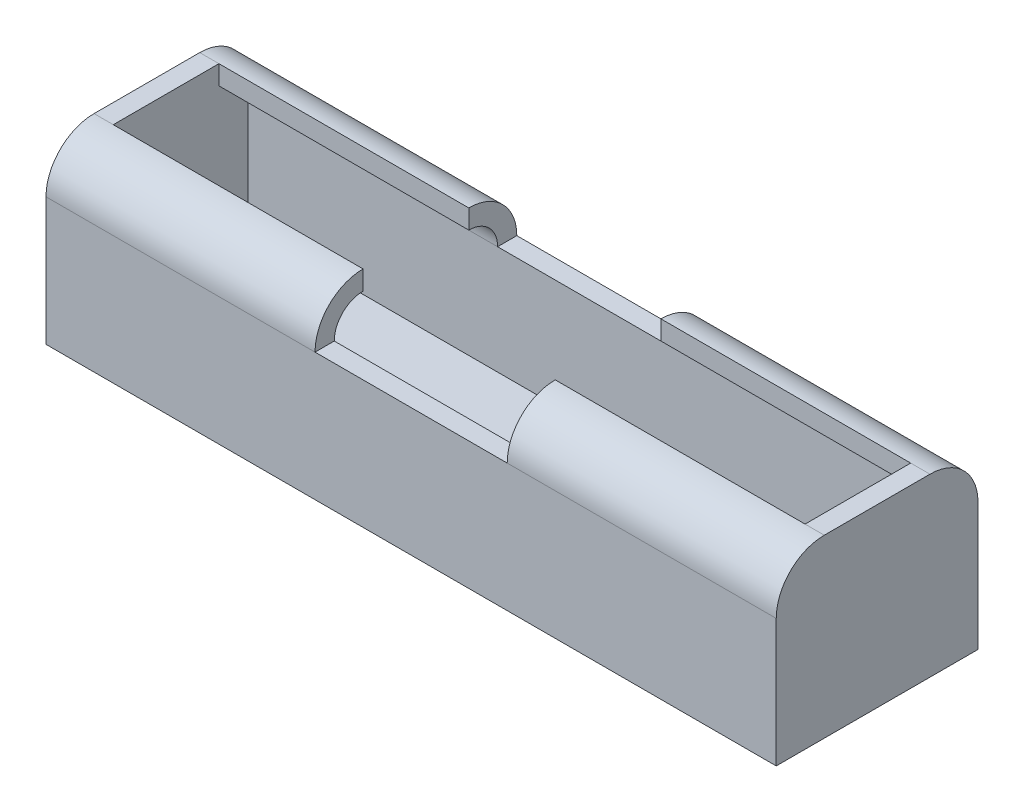
ISO-10303-21;
HEADER;
FILE_DESCRIPTION(('STEP AP214'),'2;1');
FILE_NAME('part.step','',(''),(''),'','','');
FILE_SCHEMA(('AUTOMOTIVE_DESIGN { 1 0 10303 214 1 1 1 1 }'));
ENDSEC;
DATA;
#1=APPLICATION_CONTEXT('core data for automotive mechanical design processes');
#2=APPLICATION_PROTOCOL_DEFINITION('international standard','automotive_design',2000,#1);
#3=PRODUCT_CONTEXT('',#1,'mechanical');
#4=PRODUCT('Part','Part','',(#3));
#5=PRODUCT_RELATED_PRODUCT_CATEGORY('part','',(#4));
#6=PRODUCT_DEFINITION_FORMATION('','',#4);
#7=PRODUCT_DEFINITION_CONTEXT('part definition',#1,'design');
#8=PRODUCT_DEFINITION('design','',#6,#7);
#9=PRODUCT_DEFINITION_SHAPE('','',#8);
#10=(LENGTH_UNIT() NAMED_UNIT(*) SI_UNIT(.MILLI.,.METRE.));
#11=(NAMED_UNIT(*) PLANE_ANGLE_UNIT() SI_UNIT($,.RADIAN.));
#12=(NAMED_UNIT(*) SI_UNIT($,.STERADIAN.) SOLID_ANGLE_UNIT());
#13=UNCERTAINTY_MEASURE_WITH_UNIT(LENGTH_MEASURE(1.E-05),#10,'distance_accuracy_value','');
#14=(GEOMETRIC_REPRESENTATION_CONTEXT(3) GLOBAL_UNCERTAINTY_ASSIGNED_CONTEXT((#13)) GLOBAL_UNIT_ASSIGNED_CONTEXT((#10,
#11,#12)) REPRESENTATION_CONTEXT('',''));
#15=CARTESIAN_POINT('',(0.,0.,0.));
#16=DIRECTION('',(0.,0.,1.));
#17=DIRECTION('',(1.,0.,0.));
#18=AXIS2_PLACEMENT_3D('',#15,#16,#17);
#19=CARTESIAN_POINT('',(38.,4.15,-5.5));
#20=DIRECTION('',(-1.,0.,0.));
#21=DIRECTION('',(0.,0.,1.));
#22=AXIS2_PLACEMENT_3D('',#19,#20,#21);
#23=CYLINDRICAL_SURFACE('',#22,5.);
#24=DIRECTION('',(-1.,0.,0.));
#25=VECTOR('',#24,1.);
#26=CARTESIAN_POINT('',(38.,4.14999999999996,-10.5));
#27=LINE('',#26,#25);
#28=CARTESIAN_POINT('',(38.,4.14999999999996,-10.5));
#29=VERTEX_POINT('',#28);
#30=CARTESIAN_POINT('',(10.,4.15,-10.5));
#31=VERTEX_POINT('',#30);
#32=EDGE_CURVE('E363',#29,#31,#27,.T.);
#33=ORIENTED_EDGE('',*,*,#32,.T.);
#34=CARTESIAN_POINT('',(10.,4.15,-5.5));
#35=DIRECTION('',(1.,0.,0.));
#36=DIRECTION('',(0.,0.,-1.));
#37=AXIS2_PLACEMENT_3D('',#34,#35,#36);
#38=CIRCLE('',#37,5.);
#39=CARTESIAN_POINT('',(10.,9.15,-5.49999999999997));
#40=VERTEX_POINT('',#39);
#41=EDGE_CURVE('E247',#31,#40,#38,.T.);
#42=ORIENTED_EDGE('',*,*,#41,.T.);
#43=DIRECTION('',(-1.,0.,0.));
#44=VECTOR('',#43,1.);
#45=CARTESIAN_POINT('',(38.,9.15,-5.49999999999997));
#46=LINE('',#45,#44);
#47=CARTESIAN_POINT('',(36.,9.15,-5.49999999999997));
#48=VERTEX_POINT('',#47);
#49=EDGE_CURVE('E256',#48,#40,#46,.T.);
#50=ORIENTED_EDGE('',*,*,#49,.F.);
#51=DIRECTION('',(-1.,0.,0.));
#52=VECTOR('',#51,1.);
#53=CARTESIAN_POINT('',(38.,9.15,-5.49999999999997));
#54=LINE('',#53,#52);
#55=CARTESIAN_POINT('',(38.,9.15,-5.49999999999997));
#56=VERTEX_POINT('',#55);
#57=EDGE_CURVE('E359',#56,#48,#54,.T.);
#58=ORIENTED_EDGE('',*,*,#57,.F.);
#59=CARTESIAN_POINT('',(38.,4.15,-5.5));
#60=DIRECTION('',(1.,0.,0.));
#61=DIRECTION('',(0.,0.,-1.));
#62=AXIS2_PLACEMENT_3D('',#59,#60,#61);
#63=CIRCLE('',#62,5.);
#64=EDGE_CURVE('E326',#29,#56,#63,.T.);
#65=ORIENTED_EDGE('',*,*,#64,.F.);
#66=EDGE_LOOP('',(#33,#42,#50,#58,#65));
#67=FACE_BOUND('',#66,.T.);
#68=ADVANCED_FACE('F33',(#67),#23,.T.);
#69=CARTESIAN_POINT('',(38.,4.15,5.5));
#70=DIRECTION('',(-1.,0.,0.));
#71=DIRECTION('',(0.,0.,1.));
#72=AXIS2_PLACEMENT_3D('',#69,#70,#71);
#73=CYLINDRICAL_SURFACE('',#72,5.);
#74=DIRECTION('',(-1.,0.,0.));
#75=VECTOR('',#74,1.);
#76=CARTESIAN_POINT('',(38.,9.15,5.49999999999997));
#77=LINE('',#76,#75);
#78=CARTESIAN_POINT('',(36.,9.15,5.49999999999997));
#79=VERTEX_POINT('',#78);
#80=CARTESIAN_POINT('',(10.,9.15,5.49999999999996));
#81=VERTEX_POINT('',#80);
#82=EDGE_CURVE('E251',#79,#81,#77,.T.);
#83=ORIENTED_EDGE('',*,*,#82,.T.);
#84=CARTESIAN_POINT('',(10.,4.15,5.5));
#85=DIRECTION('',(1.,0.,0.));
#86=DIRECTION('',(0.,0.,-1.));
#87=AXIS2_PLACEMENT_3D('',#84,#85,#86);
#88=CIRCLE('',#87,5.);
#89=CARTESIAN_POINT('',(10.,4.15,10.5));
#90=VERTEX_POINT('',#89);
#91=EDGE_CURVE('E240',#81,#90,#88,.T.);
#92=ORIENTED_EDGE('',*,*,#91,.T.);
#93=DIRECTION('',(-1.,0.,0.));
#94=VECTOR('',#93,1.);
#95=CARTESIAN_POINT('',(38.,4.14999999999996,10.5));
#96=LINE('',#95,#94);
#97=CARTESIAN_POINT('',(38.,4.14999999999996,10.5));
#98=VERTEX_POINT('',#97);
#99=EDGE_CURVE('E209',#98,#90,#96,.T.);
#100=ORIENTED_EDGE('',*,*,#99,.F.);
#101=CARTESIAN_POINT('',(38.,4.15,5.5));
#102=DIRECTION('',(1.,0.,0.));
#103=DIRECTION('',(0.,0.,-1.));
#104=AXIS2_PLACEMENT_3D('',#101,#102,#103);
#105=CIRCLE('',#104,5.);
#106=CARTESIAN_POINT('',(38.,9.15,5.49999999999997));
#107=VERTEX_POINT('',#106);
#108=EDGE_CURVE('E331',#107,#98,#105,.T.);
#109=ORIENTED_EDGE('',*,*,#108,.F.);
#110=DIRECTION('',(-1.,0.,0.));
#111=VECTOR('',#110,1.);
#112=CARTESIAN_POINT('',(38.,9.15,5.49999999999997));
#113=LINE('',#112,#111);
#114=EDGE_CURVE('E355',#107,#79,#113,.T.);
#115=ORIENTED_EDGE('',*,*,#114,.T.);
#116=EDGE_LOOP('',(#83,#92,#100,#109,#115));
#117=FACE_BOUND('',#116,.T.);
#118=ADVANCED_FACE('F427',(#117),#73,.T.);
#119=CARTESIAN_POINT('',(38.,9.15,-5.49999999999997));
#120=DIRECTION('',(0.,0.,1.));
#121=DIRECTION('',(-1.,0.,0.));
#122=AXIS2_PLACEMENT_3D('',#119,#120,#121);
#123=PLANE('',#122);
#124=ORIENTED_EDGE('',*,*,#49,.T.);
#125=DIRECTION('',(0.,1.,0.));
#126=VECTOR('',#125,1.);
#127=CARTESIAN_POINT('',(10.,9.15,-5.49999999999997));
#128=LINE('',#127,#126);
#129=CARTESIAN_POINT('',(10.,7.15,-5.49999999999997));
#130=VERTEX_POINT('',#129);
#131=EDGE_CURVE('E244',#40,#130,#128,.F.);
#132=ORIENTED_EDGE('',*,*,#131,.T.);
#133=DIRECTION('',(-1.,0.,0.));
#134=VECTOR('',#133,1.);
#135=CARTESIAN_POINT('',(0.,7.15,-5.49999999999997));
#136=LINE('',#135,#134);
#137=CARTESIAN_POINT('',(36.,7.15,-5.49999999999997));
#138=VERTEX_POINT('',#137);
#139=EDGE_CURVE('E300',#138,#130,#136,.T.);
#140=ORIENTED_EDGE('',*,*,#139,.F.);
#141=DIRECTION('',(0.,-1.,0.));
#142=VECTOR('',#141,1.);
#143=CARTESIAN_POINT('',(36.,4.15,-5.5));
#144=LINE('',#143,#142);
#145=EDGE_CURVE('E318',#138,#48,#144,.F.);
#146=ORIENTED_EDGE('',*,*,#145,.T.);
#147=EDGE_LOOP('',(#124,#132,#140,#146));
#148=FACE_BOUND('',#147,.T.);
#149=ADVANCED_FACE('F449',(#148),#123,.T.);
#150=CARTESIAN_POINT('',(38.,9.15,5.49999999999997));
#151=DIRECTION('',(0.,0.,1.));
#152=DIRECTION('',(-1.,0.,0.));
#153=AXIS2_PLACEMENT_3D('',#150,#151,#152);
#154=PLANE('',#153);
#155=DIRECTION('',(-1.,0.,0.));
#156=VECTOR('',#155,1.);
#157=CARTESIAN_POINT('',(0.,7.15,5.49999999999997));
#158=LINE('',#157,#156);
#159=CARTESIAN_POINT('',(36.,7.15,5.49999999999997));
#160=VERTEX_POINT('',#159);
#161=CARTESIAN_POINT('',(10.,7.15,5.49999999999997));
#162=VERTEX_POINT('',#161);
#163=EDGE_CURVE('E311',#160,#162,#158,.T.);
#164=ORIENTED_EDGE('',*,*,#163,.T.);
#165=DIRECTION('',(0.,1.,0.));
#166=VECTOR('',#165,1.);
#167=CARTESIAN_POINT('',(10.,9.15,5.49999999999997));
#168=LINE('',#167,#166);
#169=EDGE_CURVE('E237',#162,#81,#168,.T.);
#170=ORIENTED_EDGE('',*,*,#169,.T.);
#171=ORIENTED_EDGE('',*,*,#82,.F.);
#172=DIRECTION('',(0.,1.,0.));
#173=VECTOR('',#172,1.);
#174=CARTESIAN_POINT('',(36.,9.15,5.49999999999997));
#175=LINE('',#174,#173);
#176=EDGE_CURVE('E303',#160,#79,#175,.T.);
#177=ORIENTED_EDGE('',*,*,#176,.F.);
#178=EDGE_LOOP('',(#164,#170,#171,#177));
#179=FACE_BOUND('',#178,.T.);
#180=ADVANCED_FACE('F432',(#179),#154,.F.);
#181=CARTESIAN_POINT('',(38.,4.15,-5.5));
#182=DIRECTION('',(-1.,0.,0.));
#183=DIRECTION('',(0.,0.,1.));
#184=AXIS2_PLACEMENT_3D('',#181,#182,#183);
#185=CYLINDRICAL_SURFACE('',#184,3.);
#186=CARTESIAN_POINT('',(10.,4.15,-5.5));
#187=DIRECTION('',(1.,0.,0.));
#188=DIRECTION('',(0.,0.,-1.));
#189=AXIS2_PLACEMENT_3D('',#186,#187,#188);
#190=CIRCLE('',#189,3.);
#191=CARTESIAN_POINT('',(10.,4.15,-8.5));
#192=VERTEX_POINT('',#191);
#193=EDGE_CURVE('E242',#192,#130,#190,.T.);
#194=ORIENTED_EDGE('',*,*,#193,.F.);
#195=DIRECTION('',(-1.,0.,0.));
#196=VECTOR('',#195,1.);
#197=CARTESIAN_POINT('',(38.,4.14999999999998,-8.5));
#198=LINE('',#197,#196);
#199=CARTESIAN_POINT('',(36.,4.14999999999998,-8.5));
#200=VERTEX_POINT('',#199);
#201=EDGE_CURVE('E263',#200,#192,#198,.T.);
#202=ORIENTED_EDGE('',*,*,#201,.F.);
#203=CARTESIAN_POINT('',(36.,4.15,-5.5));
#204=DIRECTION('',(1.,0.,0.));
#205=DIRECTION('',(0.,0.,-1.));
#206=AXIS2_PLACEMENT_3D('',#203,#204,#205);
#207=CIRCLE('',#206,3.);
#208=EDGE_CURVE('E270',#200,#138,#207,.T.);
#209=ORIENTED_EDGE('',*,*,#208,.T.);
#210=ORIENTED_EDGE('',*,*,#139,.T.);
#211=EDGE_LOOP('',(#194,#202,#209,#210));
#212=FACE_BOUND('',#211,.T.);
#213=ADVANCED_FACE('F443',(#212),#185,.F.);
#214=CARTESIAN_POINT('',(38.,4.15,5.5));
#215=DIRECTION('',(-1.,0.,0.));
#216=DIRECTION('',(0.,0.,1.));
#217=AXIS2_PLACEMENT_3D('',#214,#215,#216);
#218=CYLINDRICAL_SURFACE('',#217,3.);
#219=CARTESIAN_POINT('',(10.,4.15,5.5));
#220=DIRECTION('',(1.,0.,0.));
#221=DIRECTION('',(0.,0.,-1.));
#222=AXIS2_PLACEMENT_3D('',#219,#220,#221);
#223=CIRCLE('',#222,3.);
#224=CARTESIAN_POINT('',(10.,4.14999999999996,8.5));
#225=VERTEX_POINT('',#224);
#226=EDGE_CURVE('E11',#162,#225,#223,.T.);
#227=ORIENTED_EDGE('',*,*,#226,.F.);
#228=ORIENTED_EDGE('',*,*,#163,.F.);
#229=CARTESIAN_POINT('',(36.,4.15,5.5));
#230=DIRECTION('',(1.,0.,0.));
#231=DIRECTION('',(0.,0.,-1.));
#232=AXIS2_PLACEMENT_3D('',#229,#230,#231);
#233=CIRCLE('',#232,3.);
#234=CARTESIAN_POINT('',(36.,4.14999999999996,8.5));
#235=VERTEX_POINT('',#234);
#236=EDGE_CURVE('E283',#160,#235,#233,.T.);
#237=ORIENTED_EDGE('',*,*,#236,.T.);
#238=DIRECTION('',(-1.,0.,0.));
#239=VECTOR('',#238,1.);
#240=CARTESIAN_POINT('',(38.,4.14999999999996,8.5));
#241=LINE('',#240,#239);
#242=EDGE_CURVE('E292',#235,#225,#241,.T.);
#243=ORIENTED_EDGE('',*,*,#242,.T.);
#244=EDGE_LOOP('',(#227,#228,#237,#243));
#245=FACE_BOUND('',#244,.T.);
#246=ADVANCED_FACE('F436',(#245),#218,.F.);
#247=CARTESIAN_POINT('',(38.,9.15,-5.49999999999997));
#248=DIRECTION('',(0.,-1.,0.));
#249=DIRECTION('',(0.,0.,-1.));
#250=AXIS2_PLACEMENT_3D('',#247,#248,#249);
#251=PLANE('',#250);
#252=DIRECTION('',(0.,0.,1.));
#253=VECTOR('',#252,1.);
#254=CARTESIAN_POINT('',(-36.,9.15,-5.49999999999997));
#255=LINE('',#254,#253);
#256=CARTESIAN_POINT('',(-36.,9.15,-5.49999999999997));
#257=VERTEX_POINT('',#256);
#258=CARTESIAN_POINT('',(-36.,9.15,5.49999999999997));
#259=VERTEX_POINT('',#258);
#260=EDGE_CURVE('E279',#257,#259,#255,.T.);
#261=ORIENTED_EDGE('',*,*,#260,.F.);
#262=CARTESIAN_POINT('',(-38.,9.15,-5.49999999999997));
#263=VERTEX_POINT('',#262);
#264=EDGE_CURVE('E358',#257,#263,#54,.T.);
#265=ORIENTED_EDGE('',*,*,#264,.T.);
#266=DIRECTION('',(0.,0.,1.));
#267=VECTOR('',#266,1.);
#268=CARTESIAN_POINT('',(-38.,9.15,-5.49999999999997));
#269=LINE('',#268,#267);
#270=CARTESIAN_POINT('',(-38.,9.15,5.49999999999997));
#271=VERTEX_POINT('',#270);
#272=EDGE_CURVE('E343',#263,#271,#269,.T.);
#273=ORIENTED_EDGE('',*,*,#272,.T.);
#274=EDGE_CURVE('E354',#259,#271,#113,.T.);
#275=ORIENTED_EDGE('',*,*,#274,.F.);
#276=EDGE_LOOP('',(#261,#265,#273,#275));
#277=FACE_BOUND('',#276,.T.);
#278=ADVANCED_FACE('F404',(#277),#251,.F.);
#279=CARTESIAN_POINT('',(38.,-9.15,-10.5));
#280=DIRECTION('',(0.,0.,1.));
#281=DIRECTION('',(1.,0.,0.));
#282=AXIS2_PLACEMENT_3D('',#279,#280,#281);
#283=PLANE('',#282);
#284=DIRECTION('',(0.,1.,0.));
#285=VECTOR('',#284,1.);
#286=CARTESIAN_POINT('',(-38.,-9.15,-10.5));
#287=LINE('',#286,#285);
#288=CARTESIAN_POINT('',(-38.,-9.15,-10.5));
#289=VERTEX_POINT('',#288);
#290=CARTESIAN_POINT('',(-38.,4.14999999999996,-10.5));
#291=VERTEX_POINT('',#290);
#292=EDGE_CURVE('E320',#289,#291,#287,.T.);
#293=ORIENTED_EDGE('',*,*,#292,.T.);
#294=CARTESIAN_POINT('',(-10.,4.15,-10.5));
#295=VERTEX_POINT('',#294);
#296=EDGE_CURVE('E362',#295,#291,#27,.T.);
#297=ORIENTED_EDGE('',*,*,#296,.F.);
#298=DIRECTION('',(1.,0.,0.));
#299=VECTOR('',#298,1.);
#300=CARTESIAN_POINT('',(-10.,4.15,-10.5));
#301=LINE('',#300,#299);
#302=EDGE_CURVE('E200',#295,#31,#301,.T.);
#303=ORIENTED_EDGE('',*,*,#302,.T.);
#304=ORIENTED_EDGE('',*,*,#32,.F.);
#305=DIRECTION('',(0.,1.,0.));
#306=VECTOR('',#305,1.);
#307=CARTESIAN_POINT('',(38.,-9.15,-10.5));
#308=LINE('',#307,#306);
#309=CARTESIAN_POINT('',(38.,-9.15,-10.5));
#310=VERTEX_POINT('',#309);
#311=EDGE_CURVE('E323',#310,#29,#308,.T.);
#312=ORIENTED_EDGE('',*,*,#311,.F.);
#313=DIRECTION('',(-1.,0.,0.));
#314=VECTOR('',#313,1.);
#315=CARTESIAN_POINT('',(38.,-9.15,-10.5));
#316=LINE('',#315,#314);
#317=EDGE_CURVE('E337',#310,#289,#316,.T.);
#318=ORIENTED_EDGE('',*,*,#317,.T.);
#319=EDGE_LOOP('',(#293,#297,#303,#304,#312,#318));
#320=FACE_BOUND('',#319,.T.);
#321=ADVANCED_FACE('F35',(#320),#283,.F.);
#322=CARTESIAN_POINT('',(-10.,9.15,-5.49999999999997));
#323=VERTEX_POINT('',#322);
#324=EDGE_CURVE('E254',#323,#257,#46,.T.);
#325=ORIENTED_EDGE('',*,*,#324,.F.);
#326=CARTESIAN_POINT('',(-10.,4.15,-5.5));
#327=DIRECTION('',(-1.,0.,0.));
#328=DIRECTION('',(0.,0.,1.));
#329=AXIS2_PLACEMENT_3D('',#326,#327,#328);
#330=CIRCLE('',#329,5.);
#331=EDGE_CURVE('E234',#323,#295,#330,.T.);
#332=ORIENTED_EDGE('',*,*,#331,.T.);
#333=ORIENTED_EDGE('',*,*,#296,.T.);
#334=CARTESIAN_POINT('',(-38.,4.15,-5.5));
#335=DIRECTION('',(1.,0.,0.));
#336=DIRECTION('',(0.,0.,-1.));
#337=AXIS2_PLACEMENT_3D('',#334,#335,#336);
#338=CIRCLE('',#337,5.);
#339=EDGE_CURVE('E340',#291,#263,#338,.T.);
#340=ORIENTED_EDGE('',*,*,#339,.T.);
#341=ORIENTED_EDGE('',*,*,#264,.F.);
#342=EDGE_LOOP('',(#325,#332,#333,#340,#341));
#343=FACE_BOUND('',#342,.T.);
#344=ADVANCED_FACE('F406',(#343),#23,.T.);
#345=ORIENTED_EDGE('',*,*,#57,.T.);
#346=DIRECTION('',(0.,0.,1.));
#347=VECTOR('',#346,1.);
#348=CARTESIAN_POINT('',(36.,9.15,-5.49999999999997));
#349=LINE('',#348,#347);
#350=EDGE_CURVE('E282',#48,#79,#349,.T.);
#351=ORIENTED_EDGE('',*,*,#350,.T.);
#352=ORIENTED_EDGE('',*,*,#114,.F.);
#353=DIRECTION('',(0.,0.,1.));
#354=VECTOR('',#353,1.);
#355=CARTESIAN_POINT('',(38.,9.15,-5.49999999999997));
#356=LINE('',#355,#354);
#357=EDGE_CURVE('E329',#56,#107,#356,.T.);
#358=ORIENTED_EDGE('',*,*,#357,.F.);
#359=EDGE_LOOP('',(#345,#351,#352,#358));
#360=FACE_BOUND('',#359,.T.);
#361=ADVANCED_FACE('F454',(#360),#251,.F.);
#362=CARTESIAN_POINT('',(-10.,4.15,10.5));
#363=VERTEX_POINT('',#362);
#364=CARTESIAN_POINT('',(-38.,4.14999999999996,10.5));
#365=VERTEX_POINT('',#364);
#366=EDGE_CURVE('E203',#363,#365,#96,.T.);
#367=ORIENTED_EDGE('',*,*,#366,.F.);
#368=CARTESIAN_POINT('',(-10.,4.15,5.5));
#369=DIRECTION('',(-1.,0.,0.));
#370=DIRECTION('',(0.,0.,1.));
#371=AXIS2_PLACEMENT_3D('',#368,#369,#370);
#372=CIRCLE('',#371,5.);
#373=CARTESIAN_POINT('',(-10.,9.15,5.49999999999996));
#374=VERTEX_POINT('',#373);
#375=EDGE_CURVE('E181',#363,#374,#372,.T.);
#376=ORIENTED_EDGE('',*,*,#375,.T.);
#377=EDGE_CURVE('E255',#374,#259,#77,.T.);
#378=ORIENTED_EDGE('',*,*,#377,.T.);
#379=ORIENTED_EDGE('',*,*,#274,.T.);
#380=CARTESIAN_POINT('',(-38.,4.15,5.5));
#381=DIRECTION('',(1.,0.,0.));
#382=DIRECTION('',(0.,0.,-1.));
#383=AXIS2_PLACEMENT_3D('',#380,#381,#382);
#384=CIRCLE('',#383,5.);
#385=EDGE_CURVE('E206',#271,#365,#384,.T.);
#386=ORIENTED_EDGE('',*,*,#385,.T.);
#387=EDGE_LOOP('',(#367,#376,#378,#379,#386));
#388=FACE_BOUND('',#387,.T.);
#389=ADVANCED_FACE('F204',(#388),#73,.T.);
#390=CARTESIAN_POINT('',(38.,-9.15,10.5));
#391=DIRECTION('',(0.,0.,-1.));
#392=DIRECTION('',(-1.,0.,0.));
#393=AXIS2_PLACEMENT_3D('',#390,#391,#392);
#394=PLANE('',#393);
#395=DIRECTION('',(0.,-1.,0.));
#396=VECTOR('',#395,1.);
#397=CARTESIAN_POINT('',(-38.,-9.15,10.5));
#398=LINE('',#397,#396);
#399=CARTESIAN_POINT('',(-38.,-9.15,10.5));
#400=VERTEX_POINT('',#399);
#401=EDGE_CURVE('E347',#365,#400,#398,.T.);
#402=ORIENTED_EDGE('',*,*,#401,.T.);
#403=DIRECTION('',(-1.,0.,0.));
#404=VECTOR('',#403,1.);
#405=CARTESIAN_POINT('',(38.,-9.15,10.5));
#406=LINE('',#405,#404);
#407=CARTESIAN_POINT('',(38.,-9.15,10.5));
#408=VERTEX_POINT('',#407);
#409=EDGE_CURVE('E210',#408,#400,#406,.T.);
#410=ORIENTED_EDGE('',*,*,#409,.F.);
#411=DIRECTION('',(0.,-1.,0.));
#412=VECTOR('',#411,1.);
#413=CARTESIAN_POINT('',(38.,-9.15,10.5));
#414=LINE('',#413,#412);
#415=EDGE_CURVE('E333',#98,#408,#414,.T.);
#416=ORIENTED_EDGE('',*,*,#415,.F.);
#417=ORIENTED_EDGE('',*,*,#99,.T.);
#418=DIRECTION('',(1.,0.,0.));
#419=VECTOR('',#418,1.);
#420=CARTESIAN_POINT('',(-10.,4.15,10.5));
#421=LINE('',#420,#419);
#422=EDGE_CURVE('E195',#363,#90,#421,.T.);
#423=ORIENTED_EDGE('',*,*,#422,.F.);
#424=ORIENTED_EDGE('',*,*,#366,.T.);
#425=EDGE_LOOP('',(#402,#410,#416,#417,#423,#424));
#426=FACE_BOUND('',#425,.T.);
#427=ADVANCED_FACE('F213',(#426),#394,.F.);
#428=CARTESIAN_POINT('',(38.,-9.15,-10.5));
#429=DIRECTION('',(0.,1.,0.));
#430=DIRECTION('',(0.,0.,1.));
#431=AXIS2_PLACEMENT_3D('',#428,#429,#430);
#432=PLANE('',#431);
#433=CARTESIAN_POINT('',(0.,-9.15000000000001,0.));
#434=DIRECTION('',(0.,1.,0.));
#435=DIRECTION('',(0.,0.,1.));
#436=AXIS2_PLACEMENT_3D('',#433,#434,#435);
#437=CIRCLE('',#436,1.75);
#438=CARTESIAN_POINT('',(0.,-9.15000000000001,1.75));
#439=VERTEX_POINT('',#438);
#440=EDGE_CURVE('E216',#439,#439,#437,.T.);
#441=ORIENTED_EDGE('',*,*,#440,.T.);
#442=EDGE_LOOP('',(#441));
#443=FACE_BOUND('',#442,.T.);
#444=DIRECTION('',(0.,0.,-1.));
#445=VECTOR('',#444,1.);
#446=CARTESIAN_POINT('',(-38.,-9.15,-10.5));
#447=LINE('',#446,#445);
#448=EDGE_CURVE('E327',#400,#289,#447,.T.);
#449=ORIENTED_EDGE('',*,*,#448,.T.);
#450=ORIENTED_EDGE('',*,*,#317,.F.);
#451=DIRECTION('',(0.,0.,-1.));
#452=VECTOR('',#451,1.);
#453=CARTESIAN_POINT('',(38.,-9.15,-10.5));
#454=LINE('',#453,#452);
#455=EDGE_CURVE('E335',#408,#310,#454,.T.);
#456=ORIENTED_EDGE('',*,*,#455,.F.);
#457=ORIENTED_EDGE('',*,*,#409,.T.);
#458=EDGE_LOOP('',(#449,#450,#456,#457));
#459=FACE_BOUND('',#458,.T.);
#460=ADVANCED_FACE('F417',(#443,#459),#432,.F.);
#461=CARTESIAN_POINT('',(38.,4.15,-5.5));
#462=DIRECTION('',(1.,0.,0.));
#463=DIRECTION('',(0.,0.,-1.));
#464=AXIS2_PLACEMENT_3D('',#461,#462,#463);
#465=PLANE('',#464);
#466=ORIENTED_EDGE('',*,*,#311,.T.);
#467=ORIENTED_EDGE('',*,*,#64,.T.);
#468=ORIENTED_EDGE('',*,*,#357,.T.);
#469=ORIENTED_EDGE('',*,*,#108,.T.);
#470=ORIENTED_EDGE('',*,*,#415,.T.);
#471=ORIENTED_EDGE('',*,*,#455,.T.);
#472=EDGE_LOOP('',(#466,#467,#468,#469,#470,#471));
#473=FACE_BOUND('',#472,.T.);
#474=ADVANCED_FACE('F421',(#473),#465,.T.);
#475=CARTESIAN_POINT('',(-38.,4.15,-5.5));
#476=DIRECTION('',(1.,0.,0.));
#477=DIRECTION('',(0.,0.,-1.));
#478=AXIS2_PLACEMENT_3D('',#475,#476,#477);
#479=PLANE('',#478);
#480=ORIENTED_EDGE('',*,*,#292,.F.);
#481=ORIENTED_EDGE('',*,*,#448,.F.);
#482=ORIENTED_EDGE('',*,*,#401,.F.);
#483=ORIENTED_EDGE('',*,*,#385,.F.);
#484=ORIENTED_EDGE('',*,*,#272,.F.);
#485=ORIENTED_EDGE('',*,*,#339,.F.);
#486=EDGE_LOOP('',(#480,#481,#482,#483,#484,#485));
#487=FACE_BOUND('',#486,.T.);
#488=ADVANCED_FACE('F412',(#487),#479,.F.);
#489=CARTESIAN_POINT('',(-10.,7.15,-5.49999999999997));
#490=VERTEX_POINT('',#489);
#491=CARTESIAN_POINT('',(-36.,7.15,-5.49999999999997));
#492=VERTEX_POINT('',#491);
#493=EDGE_CURVE('E304',#490,#492,#136,.T.);
#494=ORIENTED_EDGE('',*,*,#493,.F.);
#495=DIRECTION('',(0.,-1.,0.));
#496=VECTOR('',#495,1.);
#497=CARTESIAN_POINT('',(-10.,9.15,-5.49999999999997));
#498=LINE('',#497,#496);
#499=EDGE_CURVE('E48',#490,#323,#498,.F.);
#500=ORIENTED_EDGE('',*,*,#499,.T.);
#501=ORIENTED_EDGE('',*,*,#324,.T.);
#502=DIRECTION('',(0.,1.,0.));
#503=VECTOR('',#502,1.);
#504=CARTESIAN_POINT('',(-36.,9.15,-5.49999999999997));
#505=LINE('',#504,#503);
#506=EDGE_CURVE('E310',#492,#257,#505,.T.);
#507=ORIENTED_EDGE('',*,*,#506,.F.);
#508=EDGE_LOOP('',(#494,#500,#501,#507));
#509=FACE_BOUND('',#508,.T.);
#510=ADVANCED_FACE('F398',(#509),#123,.T.);
#511=ORIENTED_EDGE('',*,*,#377,.F.);
#512=DIRECTION('',(0.,-1.,0.));
#513=VECTOR('',#512,1.);
#514=CARTESIAN_POINT('',(-10.,9.15,5.49999999999997));
#515=LINE('',#514,#513);
#516=CARTESIAN_POINT('',(-10.,7.15,5.49999999999997));
#517=VERTEX_POINT('',#516);
#518=EDGE_CURVE('E187',#374,#517,#515,.T.);
#519=ORIENTED_EDGE('',*,*,#518,.T.);
#520=CARTESIAN_POINT('',(-36.,7.15,5.49999999999997));
#521=VERTEX_POINT('',#520);
#522=EDGE_CURVE('E266',#517,#521,#158,.T.);
#523=ORIENTED_EDGE('',*,*,#522,.T.);
#524=DIRECTION('',(0.,1.,0.));
#525=VECTOR('',#524,1.);
#526=CARTESIAN_POINT('',(-36.,9.15,5.49999999999997));
#527=LINE('',#526,#525);
#528=EDGE_CURVE('E307',#521,#259,#527,.T.);
#529=ORIENTED_EDGE('',*,*,#528,.T.);
#530=EDGE_LOOP('',(#511,#519,#523,#529));
#531=FACE_BOUND('',#530,.T.);
#532=ADVANCED_FACE('F369',(#531),#154,.F.);
#533=CARTESIAN_POINT('',(38.,-9.15,-8.5));
#534=DIRECTION('',(0.,0.,1.));
#535=DIRECTION('',(1.,0.,0.));
#536=AXIS2_PLACEMENT_3D('',#533,#534,#535);
#537=PLANE('',#536);
#538=DIRECTION('',(0.,1.,0.));
#539=VECTOR('',#538,1.);
#540=CARTESIAN_POINT('',(-36.,-9.15,-8.5));
#541=LINE('',#540,#539);
#542=CARTESIAN_POINT('',(-36.,-7.15,-8.5));
#543=VERTEX_POINT('',#542);
#544=CARTESIAN_POINT('',(-36.,4.14999999999998,-8.5));
#545=VERTEX_POINT('',#544);
#546=EDGE_CURVE('E250',#543,#545,#541,.T.);
#547=ORIENTED_EDGE('',*,*,#546,.F.);
#548=DIRECTION('',(-1.,0.,0.));
#549=VECTOR('',#548,1.);
#550=CARTESIAN_POINT('',(38.,-7.15,-8.5));
#551=LINE('',#550,#549);
#552=CARTESIAN_POINT('',(36.,-7.15,-8.5));
#553=VERTEX_POINT('',#552);
#554=EDGE_CURVE('E272',#553,#543,#551,.T.);
#555=ORIENTED_EDGE('',*,*,#554,.F.);
#556=DIRECTION('',(0.,1.,0.));
#557=VECTOR('',#556,1.);
#558=CARTESIAN_POINT('',(36.,-9.15,-8.5));
#559=LINE('',#558,#557);
#560=EDGE_CURVE('E267',#553,#200,#559,.T.);
#561=ORIENTED_EDGE('',*,*,#560,.T.);
#562=ORIENTED_EDGE('',*,*,#201,.T.);
#563=DIRECTION('',(-1.,0.,0.));
#564=VECTOR('',#563,1.);
#565=CARTESIAN_POINT('',(38.,4.15,-8.5));
#566=LINE('',#565,#564);
#567=CARTESIAN_POINT('',(-10.,4.15,-8.5));
#568=VERTEX_POINT('',#567);
#569=EDGE_CURVE('E227',#568,#192,#566,.F.);
#570=ORIENTED_EDGE('',*,*,#569,.F.);
#571=EDGE_CURVE('E259',#568,#545,#198,.T.);
#572=ORIENTED_EDGE('',*,*,#571,.T.);
#573=EDGE_LOOP('',(#547,#555,#561,#562,#570,#572));
#574=FACE_BOUND('',#573,.T.);
#575=ADVANCED_FACE('F389',(#574),#537,.T.);
#576=CARTESIAN_POINT('',(-10.,4.15,-5.5));
#577=DIRECTION('',(-1.,0.,0.));
#578=DIRECTION('',(0.,0.,1.));
#579=AXIS2_PLACEMENT_3D('',#576,#577,#578);
#580=CIRCLE('',#579,3.);
#581=EDGE_CURVE('E191',#490,#568,#580,.T.);
#582=ORIENTED_EDGE('',*,*,#581,.F.);
#583=ORIENTED_EDGE('',*,*,#493,.T.);
#584=CARTESIAN_POINT('',(-36.,4.15,-5.5));
#585=DIRECTION('',(1.,0.,0.));
#586=DIRECTION('',(0.,0.,-1.));
#587=AXIS2_PLACEMENT_3D('',#584,#585,#586);
#588=CIRCLE('',#587,3.);
#589=EDGE_CURVE('E262',#545,#492,#588,.T.);
#590=ORIENTED_EDGE('',*,*,#589,.F.);
#591=ORIENTED_EDGE('',*,*,#571,.F.);
#592=EDGE_LOOP('',(#582,#583,#590,#591));
#593=FACE_BOUND('',#592,.T.);
#594=ADVANCED_FACE('F394',(#593),#185,.F.);
#595=CARTESIAN_POINT('',(-10.,4.15,5.5));
#596=DIRECTION('',(-1.,0.,0.));
#597=DIRECTION('',(0.,0.,1.));
#598=AXIS2_PLACEMENT_3D('',#595,#596,#597);
#599=CIRCLE('',#598,3.);
#600=CARTESIAN_POINT('',(-10.,4.15,8.5));
#601=VERTEX_POINT('',#600);
#602=EDGE_CURVE('E41',#601,#517,#599,.T.);
#603=ORIENTED_EDGE('',*,*,#602,.F.);
#604=CARTESIAN_POINT('',(-36.,4.14999999999996,8.5));
#605=VERTEX_POINT('',#604);
#606=EDGE_CURVE('E295',#601,#605,#241,.T.);
#607=ORIENTED_EDGE('',*,*,#606,.T.);
#608=CARTESIAN_POINT('',(-36.,4.15,5.5));
#609=DIRECTION('',(1.,0.,0.));
#610=DIRECTION('',(0.,0.,-1.));
#611=AXIS2_PLACEMENT_3D('',#608,#609,#610);
#612=CIRCLE('',#611,3.);
#613=EDGE_CURVE('E288',#521,#605,#612,.T.);
#614=ORIENTED_EDGE('',*,*,#613,.F.);
#615=ORIENTED_EDGE('',*,*,#522,.F.);
#616=EDGE_LOOP('',(#603,#607,#614,#615));
#617=FACE_BOUND('',#616,.T.);
#618=ADVANCED_FACE('F372',(#617),#218,.F.);
#619=CARTESIAN_POINT('',(38.,-9.15,8.5));
#620=DIRECTION('',(0.,0.,-1.));
#621=DIRECTION('',(-1.,0.,0.));
#622=AXIS2_PLACEMENT_3D('',#619,#620,#621);
#623=PLANE('',#622);
#624=DIRECTION('',(0.,-1.,0.));
#625=VECTOR('',#624,1.);
#626=CARTESIAN_POINT('',(-36.,-9.15,8.5));
#627=LINE('',#626,#625);
#628=CARTESIAN_POINT('',(-36.,-7.15,8.5));
#629=VERTEX_POINT('',#628);
#630=EDGE_CURVE('E291',#605,#629,#627,.T.);
#631=ORIENTED_EDGE('',*,*,#630,.F.);
#632=ORIENTED_EDGE('',*,*,#606,.F.);
#633=EDGE_CURVE('E198',#225,#601,#241,.T.);
#634=ORIENTED_EDGE('',*,*,#633,.F.);
#635=ORIENTED_EDGE('',*,*,#242,.F.);
#636=DIRECTION('',(0.,-1.,0.));
#637=VECTOR('',#636,1.);
#638=CARTESIAN_POINT('',(36.,-9.15,8.5));
#639=LINE('',#638,#637);
#640=CARTESIAN_POINT('',(36.,-7.15,8.5));
#641=VERTEX_POINT('',#640);
#642=EDGE_CURVE('E285',#235,#641,#639,.T.);
#643=ORIENTED_EDGE('',*,*,#642,.T.);
#644=DIRECTION('',(-1.,0.,0.));
#645=VECTOR('',#644,1.);
#646=CARTESIAN_POINT('',(38.,-7.15,8.5));
#647=LINE('',#646,#645);
#648=EDGE_CURVE('E275',#641,#629,#647,.T.);
#649=ORIENTED_EDGE('',*,*,#648,.T.);
#650=EDGE_LOOP('',(#631,#632,#634,#635,#643,#649));
#651=FACE_BOUND('',#650,.T.);
#652=ADVANCED_FACE('F377',(#651),#623,.T.);
#653=CARTESIAN_POINT('',(38.,-7.15,-10.5));
#654=DIRECTION('',(0.,1.,0.));
#655=DIRECTION('',(0.,0.,1.));
#656=AXIS2_PLACEMENT_3D('',#653,#654,#655);
#657=PLANE('',#656);
#658=CARTESIAN_POINT('',(0.,-7.15,0.));
#659=DIRECTION('',(0.,1.,0.));
#660=DIRECTION('',(0.,0.,1.));
#661=AXIS2_PLACEMENT_3D('',#658,#659,#660);
#662=CIRCLE('',#661,1.75);
#663=CARTESIAN_POINT('',(0.,-7.15,1.75));
#664=VERTEX_POINT('',#663);
#665=EDGE_CURVE('E221',#664,#664,#662,.T.);
#666=ORIENTED_EDGE('',*,*,#665,.F.);
#667=EDGE_LOOP('',(#666));
#668=FACE_BOUND('',#667,.T.);
#669=DIRECTION('',(0.,0.,-1.));
#670=VECTOR('',#669,1.);
#671=CARTESIAN_POINT('',(-36.,-7.15,-10.5));
#672=LINE('',#671,#670);
#673=EDGE_CURVE('E271',#629,#543,#672,.T.);
#674=ORIENTED_EDGE('',*,*,#673,.F.);
#675=ORIENTED_EDGE('',*,*,#648,.F.);
#676=DIRECTION('',(0.,0.,-1.));
#677=VECTOR('',#676,1.);
#678=CARTESIAN_POINT('',(36.,-7.15,-10.5));
#679=LINE('',#678,#677);
#680=EDGE_CURVE('E276',#641,#553,#679,.T.);
#681=ORIENTED_EDGE('',*,*,#680,.T.);
#682=ORIENTED_EDGE('',*,*,#554,.T.);
#683=EDGE_LOOP('',(#674,#675,#681,#682));
#684=FACE_BOUND('',#683,.T.);
#685=ADVANCED_FACE('F384',(#668,#684),#657,.T.);
#686=CARTESIAN_POINT('',(36.,4.15,-5.5));
#687=DIRECTION('',(1.,0.,0.));
#688=DIRECTION('',(0.,0.,-1.));
#689=AXIS2_PLACEMENT_3D('',#686,#687,#688);
#690=PLANE('',#689);
#691=ORIENTED_EDGE('',*,*,#560,.F.);
#692=ORIENTED_EDGE('',*,*,#680,.F.);
#693=ORIENTED_EDGE('',*,*,#642,.F.);
#694=ORIENTED_EDGE('',*,*,#236,.F.);
#695=ORIENTED_EDGE('',*,*,#176,.T.);
#696=ORIENTED_EDGE('',*,*,#350,.F.);
#697=ORIENTED_EDGE('',*,*,#145,.F.);
#698=ORIENTED_EDGE('',*,*,#208,.F.);
#699=EDGE_LOOP('',(#691,#692,#693,#694,#695,#696,#697,#698));
#700=FACE_BOUND('',#699,.T.);
#701=ADVANCED_FACE('F438',(#700),#690,.F.);
#702=CARTESIAN_POINT('',(-36.,4.15,-5.5));
#703=DIRECTION('',(1.,0.,0.));
#704=DIRECTION('',(0.,0.,-1.));
#705=AXIS2_PLACEMENT_3D('',#702,#703,#704);
#706=PLANE('',#705);
#707=ORIENTED_EDGE('',*,*,#546,.T.);
#708=ORIENTED_EDGE('',*,*,#589,.T.);
#709=ORIENTED_EDGE('',*,*,#506,.T.);
#710=ORIENTED_EDGE('',*,*,#260,.T.);
#711=ORIENTED_EDGE('',*,*,#528,.F.);
#712=ORIENTED_EDGE('',*,*,#613,.T.);
#713=ORIENTED_EDGE('',*,*,#630,.T.);
#714=ORIENTED_EDGE('',*,*,#673,.T.);
#715=EDGE_LOOP('',(#707,#708,#709,#710,#711,#712,#713,#714));
#716=FACE_BOUND('',#715,.T.);
#717=ADVANCED_FACE('F375',(#716),#706,.T.);
#718=CARTESIAN_POINT('',(-10.,4.15,-10.5));
#719=DIRECTION('',(0.,-1.,0.));
#720=DIRECTION('',(0.,0.,-1.));
#721=AXIS2_PLACEMENT_3D('',#718,#719,#720);
#722=PLANE('',#721);
#723=ORIENTED_EDGE('',*,*,#633,.T.);
#724=DIRECTION('',(0.,0.,1.));
#725=VECTOR('',#724,1.);
#726=CARTESIAN_POINT('',(-10.,4.15,-10.5));
#727=LINE('',#726,#725);
#728=EDGE_CURVE('E184',#601,#363,#727,.T.);
#729=ORIENTED_EDGE('',*,*,#728,.T.);
#730=ORIENTED_EDGE('',*,*,#422,.T.);
#731=DIRECTION('',(0.,0.,1.));
#732=VECTOR('',#731,1.);
#733=CARTESIAN_POINT('',(10.,4.15,-10.5));
#734=LINE('',#733,#732);
#735=EDGE_CURVE('E56',#225,#90,#734,.T.);
#736=ORIENTED_EDGE('',*,*,#735,.F.);
#737=EDGE_LOOP('',(#723,#729,#730,#736));
#738=FACE_BOUND('',#737,.T.);
#739=ADVANCED_FACE('F193',(#738),#722,.F.);
#740=CARTESIAN_POINT('',(-10.,4.15,-10.5));
#741=DIRECTION('',(-1.,0.,0.));
#742=DIRECTION('',(0.,0.,1.));
#743=AXIS2_PLACEMENT_3D('',#740,#741,#742);
#744=PLANE('',#743);
#745=ORIENTED_EDGE('',*,*,#728,.F.);
#746=ORIENTED_EDGE('',*,*,#602,.T.);
#747=ORIENTED_EDGE('',*,*,#518,.F.);
#748=ORIENTED_EDGE('',*,*,#375,.F.);
#749=EDGE_LOOP('',(#745,#746,#747,#748));
#750=FACE_BOUND('',#749,.T.);
#751=ADVANCED_FACE('F183',(#750),#744,.F.);
#752=CARTESIAN_POINT('',(10.,4.15,-10.5));
#753=DIRECTION('',(1.,0.,0.));
#754=DIRECTION('',(0.,0.,-1.));
#755=AXIS2_PLACEMENT_3D('',#752,#753,#754);
#756=PLANE('',#755);
#757=ORIENTED_EDGE('',*,*,#169,.F.);
#758=ORIENTED_EDGE('',*,*,#226,.T.);
#759=ORIENTED_EDGE('',*,*,#735,.T.);
#760=ORIENTED_EDGE('',*,*,#91,.F.);
#761=EDGE_LOOP('',(#757,#758,#759,#760));
#762=FACE_BOUND('',#761,.T.);
#763=ADVANCED_FACE('F429',(#762),#756,.F.);
#764=EDGE_CURVE('E225',#31,#192,#734,.T.);
#765=ORIENTED_EDGE('',*,*,#764,.T.);
#766=ORIENTED_EDGE('',*,*,#193,.T.);
#767=ORIENTED_EDGE('',*,*,#131,.F.);
#768=ORIENTED_EDGE('',*,*,#41,.F.);
#769=EDGE_LOOP('',(#765,#766,#767,#768));
#770=FACE_BOUND('',#769,.T.);
#771=ADVANCED_FACE('F446',(#770),#756,.F.);
#772=ORIENTED_EDGE('',*,*,#499,.F.);
#773=ORIENTED_EDGE('',*,*,#581,.T.);
#774=EDGE_CURVE('E199',#295,#568,#727,.T.);
#775=ORIENTED_EDGE('',*,*,#774,.F.);
#776=ORIENTED_EDGE('',*,*,#331,.F.);
#777=EDGE_LOOP('',(#772,#773,#775,#776));
#778=FACE_BOUND('',#777,.T.);
#779=ADVANCED_FACE('F501',(#778),#744,.F.);
#780=ORIENTED_EDGE('',*,*,#569,.T.);
#781=ORIENTED_EDGE('',*,*,#764,.F.);
#782=ORIENTED_EDGE('',*,*,#302,.F.);
#783=ORIENTED_EDGE('',*,*,#774,.T.);
#784=EDGE_LOOP('',(#780,#781,#782,#783));
#785=FACE_BOUND('',#784,.T.);
#786=ADVANCED_FACE('F504',(#785),#722,.F.);
#787=CARTESIAN_POINT('',(0.,-9.15000000000001,0.));
#788=DIRECTION('',(0.,1.,0.));
#789=DIRECTION('',(0.,0.,1.));
#790=AXIS2_PLACEMENT_3D('',#787,#788,#789);
#791=CYLINDRICAL_SURFACE('',#790,1.75);
#792=ORIENTED_EDGE('',*,*,#440,.F.);
#793=EDGE_LOOP('',(#792));
#794=FACE_BOUND('',#793,.T.);
#795=ORIENTED_EDGE('',*,*,#665,.T.);
#796=EDGE_LOOP('',(#795));
#797=FACE_BOUND('',#796,.T.);
#798=ADVANCED_FACE('F507',(#794,#797),#791,.F.);
#799=CLOSED_SHELL('',(#68,#118,#149,#180,#213,#246,#278,#321,#344,#361,#389,#427,#460,#474,#488,
#510,#532,#575,#594,#618,#652,#685,#701,#717,#739,#751,#763,#771,#779,#786,#798));
#800=MANIFOLD_SOLID_BREP('B2',#799);
#801=ADVANCED_BREP_SHAPE_REPRESENTATION('',(#18,#800),#14);
#802=SHAPE_DEFINITION_REPRESENTATION(#9,#801);
ENDSEC;
END-ISO-10303-21;
